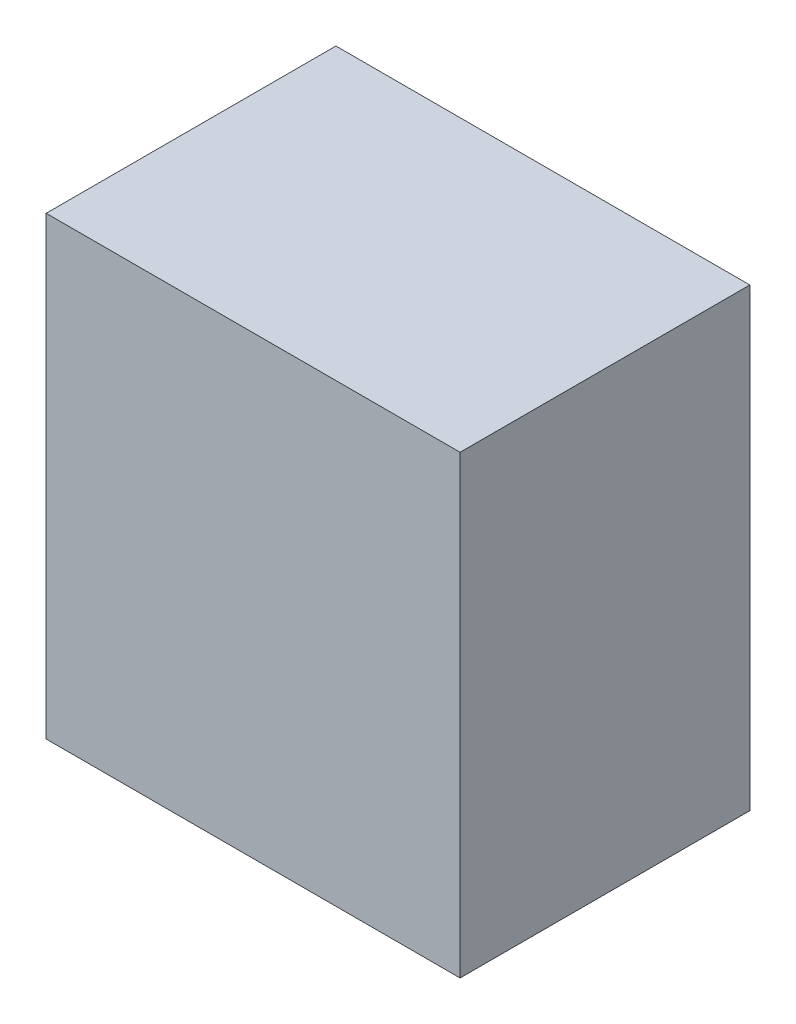
ISO-10303-21;
HEADER;
FILE_DESCRIPTION(('STEP AP214'),'2;1');
FILE_NAME('part.step','',(''),(''),'','','');
FILE_SCHEMA(('AUTOMOTIVE_DESIGN { 1 0 10303 214 1 1 1 1 }'));
ENDSEC;
DATA;
#1=APPLICATION_CONTEXT('core data for automotive mechanical design processes');
#2=APPLICATION_PROTOCOL_DEFINITION('international standard','automotive_design',2000,#1);
#3=PRODUCT_CONTEXT('',#1,'mechanical');
#4=PRODUCT('Part','Part','',(#3));
#5=PRODUCT_RELATED_PRODUCT_CATEGORY('part','',(#4));
#6=PRODUCT_DEFINITION_FORMATION('','',#4);
#7=PRODUCT_DEFINITION_CONTEXT('part definition',#1,'design');
#8=PRODUCT_DEFINITION('design','',#6,#7);
#9=PRODUCT_DEFINITION_SHAPE('','',#8);
#10=(LENGTH_UNIT() NAMED_UNIT(*) SI_UNIT(.MILLI.,.METRE.));
#11=(NAMED_UNIT(*) PLANE_ANGLE_UNIT() SI_UNIT($,.RADIAN.));
#12=(NAMED_UNIT(*) SI_UNIT($,.STERADIAN.) SOLID_ANGLE_UNIT());
#13=UNCERTAINTY_MEASURE_WITH_UNIT(LENGTH_MEASURE(1.E-05),#10,'distance_accuracy_value','');
#14=(GEOMETRIC_REPRESENTATION_CONTEXT(3) GLOBAL_UNCERTAINTY_ASSIGNED_CONTEXT((#13)) GLOBAL_UNIT_ASSIGNED_CONTEXT((#10,
#11,#12)) REPRESENTATION_CONTEXT('',''));
#15=CARTESIAN_POINT('',(0.,0.,0.));
#16=DIRECTION('',(0.,0.,1.));
#17=DIRECTION('',(1.,0.,0.));
#18=AXIS2_PLACEMENT_3D('',#15,#16,#17);
#19=CARTESIAN_POINT('',(0.499999,0.5499989,0.70000114));
#20=DIRECTION('',(0.,0.,-1.));
#21=DIRECTION('',(-1.,0.,0.));
#22=AXIS2_PLACEMENT_3D('',#19,#20,#21);
#23=PLANE('',#22);
#24=DIRECTION('',(0.,1.,0.));
#25=VECTOR('',#24,1.);
#26=CARTESIAN_POINT('',(-0.499999,0.5499989,0.70000114));
#27=LINE('',#26,#25);
#28=CARTESIAN_POINT('',(-0.499999,0.5499989,0.70000114));
#29=VERTEX_POINT('',#28);
#30=CARTESIAN_POINT('',(-0.499999,-0.5499989,0.70000114));
#31=VERTEX_POINT('',#30);
#32=EDGE_CURVE('E55',#29,#31,#27,.F.);
#33=ORIENTED_EDGE('',*,*,#32,.T.);
#34=DIRECTION('',(1.,0.,0.));
#35=VECTOR('',#34,1.);
#36=CARTESIAN_POINT('',(-0.499999,-0.5499989,0.70000114));
#37=LINE('',#36,#35);
#38=CARTESIAN_POINT('',(0.499999,-0.5499989,0.70000114));
#39=VERTEX_POINT('',#38);
#40=EDGE_CURVE('E57',#31,#39,#37,.T.);
#41=ORIENTED_EDGE('',*,*,#40,.T.);
#42=DIRECTION('',(0.,1.,0.));
#43=VECTOR('',#42,1.);
#44=CARTESIAN_POINT('',(0.499999,-0.5499989,0.70000114));
#45=LINE('',#44,#43);
#46=CARTESIAN_POINT('',(0.499999,0.5499989,0.70000114));
#47=VERTEX_POINT('',#46);
#48=EDGE_CURVE('E20',#39,#47,#45,.T.);
#49=ORIENTED_EDGE('',*,*,#48,.T.);
#50=DIRECTION('',(1.,0.,0.));
#51=VECTOR('',#50,1.);
#52=CARTESIAN_POINT('',(0.499999,0.5499989,0.70000114));
#53=LINE('',#52,#51);
#54=EDGE_CURVE('E80',#47,#29,#53,.F.);
#55=ORIENTED_EDGE('',*,*,#54,.T.);
#56=EDGE_LOOP('',(#33,#41,#49,#55));
#57=FACE_BOUND('',#56,.T.);
#58=ADVANCED_FACE('F17',(#57),#23,.F.);
#59=CARTESIAN_POINT('',(0.499999,-0.5499989,0.));
#60=DIRECTION('',(-1.,0.,0.));
#61=DIRECTION('',(0.,0.,1.));
#62=AXIS2_PLACEMENT_3D('',#59,#60,#61);
#63=PLANE('',#62);
#64=DIRECTION('',(0.,0.,-1.));
#65=VECTOR('',#64,1.);
#66=CARTESIAN_POINT('',(0.499999,0.5499989,0.));
#67=LINE('',#66,#65);
#68=CARTESIAN_POINT('',(0.499999,0.5499989,0.));
#69=VERTEX_POINT('',#68);
#70=EDGE_CURVE('E68',#69,#47,#67,.F.);
#71=ORIENTED_EDGE('',*,*,#70,.T.);
#72=ORIENTED_EDGE('',*,*,#48,.F.);
#73=DIRECTION('',(0.,0.,1.));
#74=VECTOR('',#73,1.);
#75=CARTESIAN_POINT('',(0.499999,-0.5499989,0.));
#76=LINE('',#75,#74);
#77=CARTESIAN_POINT('',(0.499999,-0.5499989,0.));
#78=VERTEX_POINT('',#77);
#79=EDGE_CURVE('E63',#39,#78,#76,.F.);
#80=ORIENTED_EDGE('',*,*,#79,.T.);
#81=DIRECTION('',(0.,1.,0.));
#82=VECTOR('',#81,1.);
#83=CARTESIAN_POINT('',(0.499999,0.5499989,0.));
#84=LINE('',#83,#82);
#85=EDGE_CURVE('E83',#69,#78,#84,.F.);
#86=ORIENTED_EDGE('',*,*,#85,.F.);
#87=EDGE_LOOP('',(#71,#72,#80,#86));
#88=FACE_BOUND('',#87,.T.);
#89=ADVANCED_FACE('F65',(#88),#63,.F.);
#90=CARTESIAN_POINT('',(-0.499999,-0.5499989,0.));
#91=DIRECTION('',(0.,1.,0.));
#92=DIRECTION('',(0.,0.,1.));
#93=AXIS2_PLACEMENT_3D('',#90,#91,#92);
#94=PLANE('',#93);
#95=ORIENTED_EDGE('',*,*,#79,.F.);
#96=ORIENTED_EDGE('',*,*,#40,.F.);
#97=DIRECTION('',(0.,0.,-1.));
#98=VECTOR('',#97,1.);
#99=CARTESIAN_POINT('',(-0.499999,-0.5499989,0.));
#100=LINE('',#99,#98);
#101=CARTESIAN_POINT('',(-0.499999,-0.5499989,0.));
#102=VERTEX_POINT('',#101);
#103=EDGE_CURVE('E75',#31,#102,#100,.T.);
#104=ORIENTED_EDGE('',*,*,#103,.T.);
#105=DIRECTION('',(-1.,0.,0.));
#106=VECTOR('',#105,1.);
#107=CARTESIAN_POINT('',(0.499999,-0.5499989,0.));
#108=LINE('',#107,#106);
#109=EDGE_CURVE('E72',#78,#102,#108,.T.);
#110=ORIENTED_EDGE('',*,*,#109,.F.);
#111=EDGE_LOOP('',(#95,#96,#104,#110));
#112=FACE_BOUND('',#111,.T.);
#113=ADVANCED_FACE('F70',(#112),#94,.F.);
#114=CARTESIAN_POINT('',(-0.499999,0.5499989,0.));
#115=DIRECTION('',(1.,0.,0.));
#116=DIRECTION('',(0.,0.,-1.));
#117=AXIS2_PLACEMENT_3D('',#114,#115,#116);
#118=PLANE('',#117);
#119=ORIENTED_EDGE('',*,*,#103,.F.);
#120=ORIENTED_EDGE('',*,*,#32,.F.);
#121=DIRECTION('',(0.,0.,-1.));
#122=VECTOR('',#121,1.);
#123=CARTESIAN_POINT('',(-0.499999,0.5499989,0.));
#124=LINE('',#123,#122);
#125=CARTESIAN_POINT('',(-0.499999,0.5499989,0.));
#126=VERTEX_POINT('',#125);
#127=EDGE_CURVE('E35',#29,#126,#124,.T.);
#128=ORIENTED_EDGE('',*,*,#127,.T.);
#129=DIRECTION('',(0.,1.,0.));
#130=VECTOR('',#129,1.);
#131=CARTESIAN_POINT('',(-0.499999,0.5499989,0.));
#132=LINE('',#131,#130);
#133=EDGE_CURVE('E26',#102,#126,#132,.T.);
#134=ORIENTED_EDGE('',*,*,#133,.F.);
#135=EDGE_LOOP('',(#119,#120,#128,#134));
#136=FACE_BOUND('',#135,.T.);
#137=ADVANCED_FACE('F89',(#136),#118,.F.);
#138=CARTESIAN_POINT('',(0.499999,0.5499989,0.));
#139=DIRECTION('',(0.,-1.,0.));
#140=DIRECTION('',(0.,0.,-1.));
#141=AXIS2_PLACEMENT_3D('',#138,#139,#140);
#142=PLANE('',#141);
#143=ORIENTED_EDGE('',*,*,#127,.F.);
#144=ORIENTED_EDGE('',*,*,#54,.F.);
#145=ORIENTED_EDGE('',*,*,#70,.F.);
#146=DIRECTION('',(-1.,0.,0.));
#147=VECTOR('',#146,1.);
#148=CARTESIAN_POINT('',(0.499999,0.5499989,0.));
#149=LINE('',#148,#147);
#150=EDGE_CURVE('E11',#126,#69,#149,.F.);
#151=ORIENTED_EDGE('',*,*,#150,.F.);
#152=EDGE_LOOP('',(#143,#144,#145,#151));
#153=FACE_BOUND('',#152,.T.);
#154=ADVANCED_FACE('F91',(#153),#142,.F.);
#155=CARTESIAN_POINT('',(0.499999,0.5499989,0.));
#156=DIRECTION('',(0.,0.,-1.));
#157=DIRECTION('',(-1.,0.,0.));
#158=AXIS2_PLACEMENT_3D('',#155,#156,#157);
#159=PLANE('',#158);
#160=ORIENTED_EDGE('',*,*,#133,.T.);
#161=ORIENTED_EDGE('',*,*,#150,.T.);
#162=ORIENTED_EDGE('',*,*,#85,.T.);
#163=ORIENTED_EDGE('',*,*,#109,.T.);
#164=EDGE_LOOP('',(#160,#161,#162,#163));
#165=FACE_BOUND('',#164,.T.);
#166=ADVANCED_FACE('F88',(#165),#159,.T.);
#167=CLOSED_SHELL('',(#58,#89,#113,#137,#154,#166));
#168=MANIFOLD_SOLID_BREP('B1',#167);
#169=ADVANCED_BREP_SHAPE_REPRESENTATION('',(#18,#168),#14);
#170=SHAPE_DEFINITION_REPRESENTATION(#9,#169);
ENDSEC;
END-ISO-10303-21;
